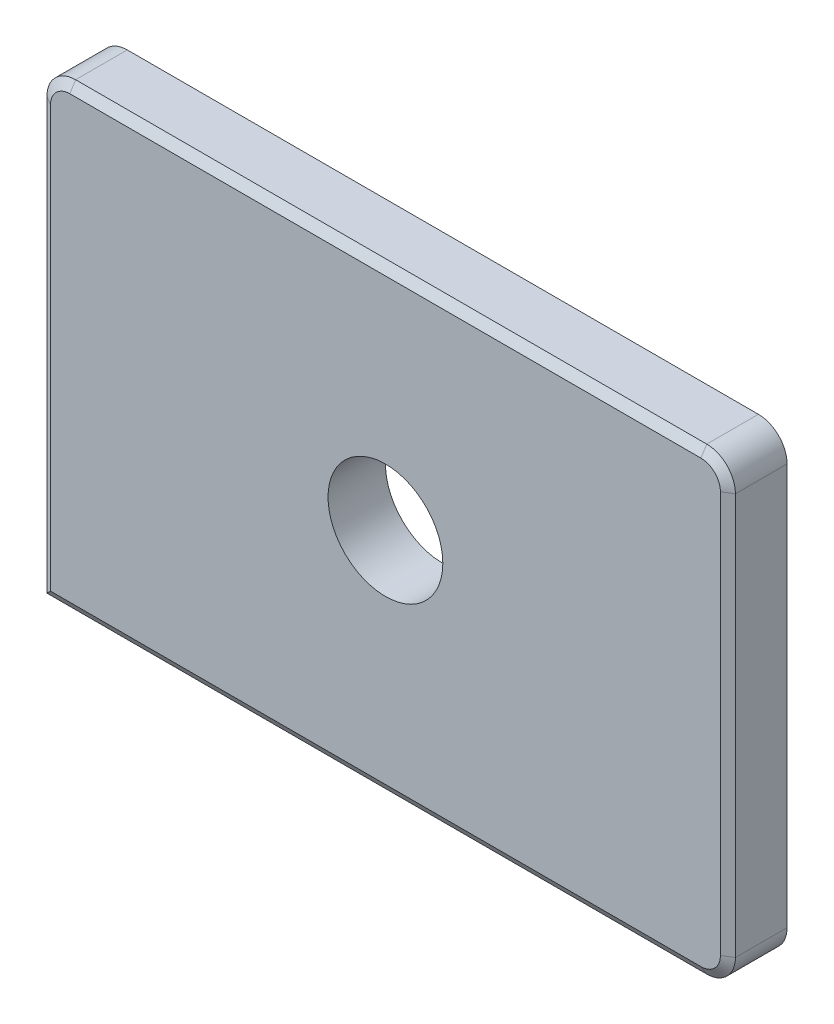
ISO-10303-21;
HEADER;
FILE_DESCRIPTION(('STEP AP214'),'2;1');
FILE_NAME('part.step','',(''),(''),'','','');
FILE_SCHEMA(('AUTOMOTIVE_DESIGN { 1 0 10303 214 1 1 1 1 }'));
ENDSEC;
DATA;
#1=APPLICATION_CONTEXT('core data for automotive mechanical design processes');
#2=APPLICATION_PROTOCOL_DEFINITION('international standard','automotive_design',2000,#1);
#3=PRODUCT_CONTEXT('',#1,'mechanical');
#4=PRODUCT('Part','Part','',(#3));
#5=PRODUCT_RELATED_PRODUCT_CATEGORY('part','',(#4));
#6=PRODUCT_DEFINITION_FORMATION('','',#4);
#7=PRODUCT_DEFINITION_CONTEXT('part definition',#1,'design');
#8=PRODUCT_DEFINITION('design','',#6,#7);
#9=PRODUCT_DEFINITION_SHAPE('','',#8);
#10=(LENGTH_UNIT() NAMED_UNIT(*) SI_UNIT(.MILLI.,.METRE.));
#11=(NAMED_UNIT(*) PLANE_ANGLE_UNIT() SI_UNIT($,.RADIAN.));
#12=(NAMED_UNIT(*) SI_UNIT($,.STERADIAN.) SOLID_ANGLE_UNIT());
#13=UNCERTAINTY_MEASURE_WITH_UNIT(LENGTH_MEASURE(1.E-05),#10,'distance_accuracy_value','');
#14=(GEOMETRIC_REPRESENTATION_CONTEXT(3) GLOBAL_UNCERTAINTY_ASSIGNED_CONTEXT((#13)) GLOBAL_UNIT_ASSIGNED_CONTEXT((#10,
#11,#12)) REPRESENTATION_CONTEXT('',''));
#15=CARTESIAN_POINT('',(0.,0.,0.));
#16=DIRECTION('',(0.,0.,1.));
#17=DIRECTION('',(1.,0.,0.));
#18=AXIS2_PLACEMENT_3D('',#15,#16,#17);
#19=CARTESIAN_POINT('',(-60.,40.,10.));
#20=DIRECTION('',(1.,0.,0.));
#21=DIRECTION('',(0.,0.,-1.));
#22=AXIS2_PLACEMENT_3D('',#19,#20,#21);
#23=PLANE('',#22);
#24=DIRECTION('',(0.,0.,-1.));
#25=VECTOR('',#24,1.);
#26=CARTESIAN_POINT('',(-60.,-40.,10.));
#27=LINE('',#26,#25);
#28=CARTESIAN_POINT('',(-60.,-40.,9.));
#29=VERTEX_POINT('',#28);
#30=CARTESIAN_POINT('',(-60.,-40.,0.));
#31=VERTEX_POINT('',#30);
#32=EDGE_CURVE('E122',#29,#31,#27,.T.);
#33=ORIENTED_EDGE('',*,*,#32,.F.);
#34=DIRECTION('',(0.,1.,0.));
#35=VECTOR('',#34,1.);
#36=CARTESIAN_POINT('',(-60.,35.,9.));
#37=LINE('',#36,#35);
#38=CARTESIAN_POINT('',(-60.,35.,9.));
#39=VERTEX_POINT('',#38);
#40=EDGE_CURVE('E189',#29,#39,#37,.T.);
#41=ORIENTED_EDGE('',*,*,#40,.T.);
#42=DIRECTION('',(0.,0.,-1.));
#43=VECTOR('',#42,1.);
#44=CARTESIAN_POINT('',(-60.,35.,10.));
#45=LINE('',#44,#43);
#46=CARTESIAN_POINT('',(-60.,35.,0.));
#47=VERTEX_POINT('',#46);
#48=EDGE_CURVE('E136',#39,#47,#45,.T.);
#49=ORIENTED_EDGE('',*,*,#48,.T.);
#50=DIRECTION('',(0.,-1.,0.));
#51=VECTOR('',#50,1.);
#52=CARTESIAN_POINT('',(-60.,40.,0.));
#53=LINE('',#52,#51);
#54=EDGE_CURVE('E135',#47,#31,#53,.T.);
#55=ORIENTED_EDGE('',*,*,#54,.T.);
#56=EDGE_LOOP('',(#33,#41,#49,#55));
#57=FACE_BOUND('',#56,.T.);
#58=ADVANCED_FACE('F37',(#57),#23,.F.);
#59=CARTESIAN_POINT('',(-60.,-40.,10.));
#60=DIRECTION('',(0.,1.,0.));
#61=DIRECTION('',(0.,0.,1.));
#62=AXIS2_PLACEMENT_3D('',#59,#60,#61);
#63=PLANE('',#62);
#64=DIRECTION('',(0.,0.,-1.));
#65=VECTOR('',#64,1.);
#66=CARTESIAN_POINT('',(55.,-40.,10.));
#67=LINE('',#66,#65);
#68=CARTESIAN_POINT('',(55.,-40.,0.));
#69=VERTEX_POINT('',#68);
#70=CARTESIAN_POINT('',(55.,-40.,9.));
#71=VERTEX_POINT('',#70);
#72=EDGE_CURVE('E162',#69,#71,#67,.F.);
#73=ORIENTED_EDGE('',*,*,#72,.T.);
#74=DIRECTION('',(-1.,0.,0.));
#75=VECTOR('',#74,1.);
#76=CARTESIAN_POINT('',(-60.,-40.,9.));
#77=LINE('',#76,#75);
#78=EDGE_CURVE('E128',#71,#29,#77,.T.);
#79=ORIENTED_EDGE('',*,*,#78,.T.);
#80=ORIENTED_EDGE('',*,*,#32,.T.);
#81=DIRECTION('',(1.,0.,0.));
#82=VECTOR('',#81,1.);
#83=CARTESIAN_POINT('',(-60.,-40.,0.));
#84=LINE('',#83,#82);
#85=EDGE_CURVE('E126',#31,#69,#84,.T.);
#86=ORIENTED_EDGE('',*,*,#85,.T.);
#87=EDGE_LOOP('',(#73,#79,#80,#86));
#88=FACE_BOUND('',#87,.T.);
#89=ADVANCED_FACE('F124',(#88),#63,.F.);
#90=CARTESIAN_POINT('',(60.,40.,10.));
#91=DIRECTION('',(-1.,0.,0.));
#92=DIRECTION('',(0.,0.,1.));
#93=AXIS2_PLACEMENT_3D('',#90,#91,#92);
#94=PLANE('',#93);
#95=DIRECTION('',(0.,0.,-1.));
#96=VECTOR('',#95,1.);
#97=CARTESIAN_POINT('',(60.,35.,10.));
#98=LINE('',#97,#96);
#99=CARTESIAN_POINT('',(60.,35.,0.));
#100=VERTEX_POINT('',#99);
#101=CARTESIAN_POINT('',(60.,35.,9.));
#102=VERTEX_POINT('',#101);
#103=EDGE_CURVE('E131',#100,#102,#98,.F.);
#104=ORIENTED_EDGE('',*,*,#103,.T.);
#105=DIRECTION('',(0.,-1.,0.));
#106=VECTOR('',#105,1.);
#107=CARTESIAN_POINT('',(60.,-35.,9.));
#108=LINE('',#107,#106);
#109=CARTESIAN_POINT('',(60.,-35.,9.));
#110=VERTEX_POINT('',#109);
#111=EDGE_CURVE('E186',#102,#110,#108,.T.);
#112=ORIENTED_EDGE('',*,*,#111,.T.);
#113=DIRECTION('',(0.,0.,-1.));
#114=VECTOR('',#113,1.);
#115=CARTESIAN_POINT('',(60.,-35.,10.));
#116=LINE('',#115,#114);
#117=CARTESIAN_POINT('',(60.,-35.,0.));
#118=VERTEX_POINT('',#117);
#119=EDGE_CURVE('E155',#110,#118,#116,.T.);
#120=ORIENTED_EDGE('',*,*,#119,.T.);
#121=DIRECTION('',(0.,1.,0.));
#122=VECTOR('',#121,1.);
#123=CARTESIAN_POINT('',(60.,40.,0.));
#124=LINE('',#123,#122);
#125=EDGE_CURVE('E145',#118,#100,#124,.T.);
#126=ORIENTED_EDGE('',*,*,#125,.T.);
#127=EDGE_LOOP('',(#104,#112,#120,#126));
#128=FACE_BOUND('',#127,.T.);
#129=ADVANCED_FACE('F242',(#128),#94,.F.);
#130=CARTESIAN_POINT('',(-60.,40.,10.));
#131=DIRECTION('',(0.,-1.,0.));
#132=DIRECTION('',(0.,0.,-1.));
#133=AXIS2_PLACEMENT_3D('',#130,#131,#132);
#134=PLANE('',#133);
#135=DIRECTION('',(0.,0.,-1.));
#136=VECTOR('',#135,1.);
#137=CARTESIAN_POINT('',(-55.,40.,10.));
#138=LINE('',#137,#136);
#139=CARTESIAN_POINT('',(-55.,40.,0.));
#140=VERTEX_POINT('',#139);
#141=CARTESIAN_POINT('',(-55.,40.,9.));
#142=VERTEX_POINT('',#141);
#143=EDGE_CURVE('E167',#140,#142,#138,.F.);
#144=ORIENTED_EDGE('',*,*,#143,.T.);
#145=DIRECTION('',(1.,0.,0.));
#146=VECTOR('',#145,1.);
#147=CARTESIAN_POINT('',(55.,40.,9.));
#148=LINE('',#147,#146);
#149=CARTESIAN_POINT('',(55.,40.,9.));
#150=VERTEX_POINT('',#149);
#151=EDGE_CURVE('E11',#142,#150,#148,.T.);
#152=ORIENTED_EDGE('',*,*,#151,.T.);
#153=DIRECTION('',(0.,0.,-1.));
#154=VECTOR('',#153,1.);
#155=CARTESIAN_POINT('',(55.,40.,10.));
#156=LINE('',#155,#154);
#157=CARTESIAN_POINT('',(55.,40.,0.));
#158=VERTEX_POINT('',#157);
#159=EDGE_CURVE('E165',#150,#158,#156,.T.);
#160=ORIENTED_EDGE('',*,*,#159,.T.);
#161=DIRECTION('',(-1.,0.,0.));
#162=VECTOR('',#161,1.);
#163=CARTESIAN_POINT('',(-60.,40.,0.));
#164=LINE('',#163,#162);
#165=EDGE_CURVE('E132',#158,#140,#164,.T.);
#166=ORIENTED_EDGE('',*,*,#165,.T.);
#167=EDGE_LOOP('',(#144,#152,#160,#166));
#168=FACE_BOUND('',#167,.T.);
#169=ADVANCED_FACE('F309',(#168),#134,.F.);
#170=CARTESIAN_POINT('',(0.,0.,10.));
#171=DIRECTION('',(0.,0.,1.));
#172=DIRECTION('',(1.,0.,0.));
#173=AXIS2_PLACEMENT_3D('',#170,#171,#172);
#174=PLANE('',#173);
#175=DIRECTION('',(0.,-1.,0.));
#176=VECTOR('',#175,1.);
#177=CARTESIAN_POINT('',(-58.3802248094562,-40.,10.));
#178=LINE('',#177,#176);
#179=CARTESIAN_POINT('',(-58.3802248094562,35.,10.));
#180=VERTEX_POINT('',#179);
#181=CARTESIAN_POINT('',(-58.3802248094562,-38.3802248094562,10.));
#182=VERTEX_POINT('',#181);
#183=EDGE_CURVE('E173',#180,#182,#178,.T.);
#184=ORIENTED_EDGE('',*,*,#183,.T.);
#185=DIRECTION('',(1.,0.,0.));
#186=VECTOR('',#185,1.);
#187=CARTESIAN_POINT('',(55.,-38.3802248094562,10.));
#188=LINE('',#187,#186);
#189=CARTESIAN_POINT('',(55.,-38.3802248094562,10.));
#190=VERTEX_POINT('',#189);
#191=EDGE_CURVE('E182',#182,#190,#188,.T.);
#192=ORIENTED_EDGE('',*,*,#191,.T.);
#193=CARTESIAN_POINT('',(55.,-35.,10.));
#194=DIRECTION('',(0.,0.,1.));
#195=DIRECTION('',(1.,0.,0.));
#196=AXIS2_PLACEMENT_3D('',#193,#194,#195);
#197=CIRCLE('',#196,3.38022480945618);
#198=CARTESIAN_POINT('',(58.3802248094562,-35.,10.));
#199=VERTEX_POINT('',#198);
#200=EDGE_CURVE('E180',#190,#199,#197,.T.);
#201=ORIENTED_EDGE('',*,*,#200,.T.);
#202=DIRECTION('',(0.,1.,0.));
#203=VECTOR('',#202,1.);
#204=CARTESIAN_POINT('',(58.3802248094562,35.,10.));
#205=LINE('',#204,#203);
#206=CARTESIAN_POINT('',(58.3802248094562,35.,10.));
#207=VERTEX_POINT('',#206);
#208=EDGE_CURVE('E177',#199,#207,#205,.T.);
#209=ORIENTED_EDGE('',*,*,#208,.T.);
#210=CARTESIAN_POINT('',(55.,35.,10.));
#211=DIRECTION('',(0.,0.,1.));
#212=DIRECTION('',(1.,0.,0.));
#213=AXIS2_PLACEMENT_3D('',#210,#211,#212);
#214=CIRCLE('',#213,3.38022480945618);
#215=CARTESIAN_POINT('',(55.,38.3802248094562,10.));
#216=VERTEX_POINT('',#215);
#217=EDGE_CURVE('E175',#207,#216,#214,.T.);
#218=ORIENTED_EDGE('',*,*,#217,.T.);
#219=DIRECTION('',(-1.,0.,0.));
#220=VECTOR('',#219,1.);
#221=CARTESIAN_POINT('',(-55.,38.3802248094562,10.));
#222=LINE('',#221,#220);
#223=CARTESIAN_POINT('',(-55.,38.3802248094562,10.));
#224=VERTEX_POINT('',#223);
#225=EDGE_CURVE('E171',#216,#224,#222,.T.);
#226=ORIENTED_EDGE('',*,*,#225,.T.);
#227=CARTESIAN_POINT('',(-55.,35.,10.));
#228=DIRECTION('',(0.,0.,1.));
#229=DIRECTION('',(1.,0.,0.));
#230=AXIS2_PLACEMENT_3D('',#227,#228,#229);
#231=CIRCLE('',#230,3.38022480945618);
#232=EDGE_CURVE('E169',#224,#180,#231,.T.);
#233=ORIENTED_EDGE('',*,*,#232,.T.);
#234=EDGE_LOOP('',(#184,#192,#201,#209,#218,#226,#233));
#235=FACE_BOUND('',#234,.T.);
#236=CARTESIAN_POINT('',(0.,0.,10.));
#237=DIRECTION('',(0.,0.,1.));
#238=DIRECTION('',(1.,0.,0.));
#239=AXIS2_PLACEMENT_3D('',#236,#237,#238);
#240=CIRCLE('',#239,10.);
#241=CARTESIAN_POINT('',(10.,0.,10.));
#242=VERTEX_POINT('',#241);
#243=EDGE_CURVE('E212',#242,#242,#240,.T.);
#244=ORIENTED_EDGE('',*,*,#243,.F.);
#245=EDGE_LOOP('',(#244));
#246=FACE_BOUND('',#245,.T.);
#247=ADVANCED_FACE('F234',(#235,#246),#174,.T.);
#248=CARTESIAN_POINT('',(0.,0.,0.));
#249=DIRECTION('',(0.,0.,1.));
#250=DIRECTION('',(1.,0.,0.));
#251=AXIS2_PLACEMENT_3D('',#248,#249,#250);
#252=PLANE('',#251);
#253=CARTESIAN_POINT('',(0.,0.,0.));
#254=DIRECTION('',(0.,0.,1.));
#255=DIRECTION('',(1.,0.,0.));
#256=AXIS2_PLACEMENT_3D('',#253,#254,#255);
#257=CIRCLE('',#256,10.);
#258=CARTESIAN_POINT('',(10.,0.,0.));
#259=VERTEX_POINT('',#258);
#260=EDGE_CURVE('E139',#259,#259,#257,.T.);
#261=ORIENTED_EDGE('',*,*,#260,.T.);
#262=EDGE_LOOP('',(#261));
#263=FACE_BOUND('',#262,.T.);
#264=ORIENTED_EDGE('',*,*,#125,.F.);
#265=CARTESIAN_POINT('',(55.,-35.,0.));
#266=DIRECTION('',(0.,0.,1.));
#267=DIRECTION('',(1.,0.,0.));
#268=AXIS2_PLACEMENT_3D('',#265,#266,#267);
#269=CIRCLE('',#268,5.);
#270=EDGE_CURVE('E144',#118,#69,#269,.F.);
#271=ORIENTED_EDGE('',*,*,#270,.T.);
#272=ORIENTED_EDGE('',*,*,#85,.F.);
#273=ORIENTED_EDGE('',*,*,#54,.F.);
#274=CARTESIAN_POINT('',(-55.,35.,0.));
#275=DIRECTION('',(0.,0.,1.));
#276=DIRECTION('',(1.,0.,0.));
#277=AXIS2_PLACEMENT_3D('',#274,#275,#276);
#278=CIRCLE('',#277,5.);
#279=EDGE_CURVE('E159',#47,#140,#278,.F.);
#280=ORIENTED_EDGE('',*,*,#279,.T.);
#281=ORIENTED_EDGE('',*,*,#165,.F.);
#282=CARTESIAN_POINT('',(55.,35.,0.));
#283=DIRECTION('',(0.,0.,1.));
#284=DIRECTION('',(1.,0.,0.));
#285=AXIS2_PLACEMENT_3D('',#282,#283,#284);
#286=CIRCLE('',#285,5.);
#287=EDGE_CURVE('E157',#158,#100,#286,.F.);
#288=ORIENTED_EDGE('',*,*,#287,.T.);
#289=EDGE_LOOP('',(#264,#271,#272,#273,#280,#281,#288));
#290=FACE_BOUND('',#289,.T.);
#291=ADVANCED_FACE('F142',(#263,#290),#252,.F.);
#292=CARTESIAN_POINT('',(0.,0.,0.));
#293=DIRECTION('',(0.,0.,1.));
#294=DIRECTION('',(1.,0.,0.));
#295=AXIS2_PLACEMENT_3D('',#292,#293,#294);
#296=CYLINDRICAL_SURFACE('',#295,10.);
#297=ORIENTED_EDGE('',*,*,#260,.F.);
#298=EDGE_LOOP('',(#297));
#299=FACE_BOUND('',#298,.T.);
#300=ORIENTED_EDGE('',*,*,#243,.T.);
#301=EDGE_LOOP('',(#300));
#302=FACE_BOUND('',#301,.T.);
#303=ADVANCED_FACE('F224',(#299,#302),#296,.F.);
#304=CARTESIAN_POINT('',(55.,-35.,10.));
#305=DIRECTION('',(0.,0.,-1.));
#306=DIRECTION('',(-1.,0.,0.));
#307=AXIS2_PLACEMENT_3D('',#304,#305,#306);
#308=CYLINDRICAL_SURFACE('',#307,5.);
#309=ORIENTED_EDGE('',*,*,#119,.F.);
#310=CARTESIAN_POINT('',(55.,-35.,9.));
#311=DIRECTION('',(0.,0.,1.));
#312=DIRECTION('',(1.,0.,0.));
#313=AXIS2_PLACEMENT_3D('',#310,#311,#312);
#314=CIRCLE('',#313,5.);
#315=EDGE_CURVE('E62',#110,#71,#314,.F.);
#316=ORIENTED_EDGE('',*,*,#315,.T.);
#317=ORIENTED_EDGE('',*,*,#72,.F.);
#318=ORIENTED_EDGE('',*,*,#270,.F.);
#319=EDGE_LOOP('',(#309,#316,#317,#318));
#320=FACE_BOUND('',#319,.T.);
#321=ADVANCED_FACE('F226',(#320),#308,.T.);
#322=CARTESIAN_POINT('',(-55.,35.,10.));
#323=DIRECTION('',(0.,0.,-1.));
#324=DIRECTION('',(-1.,0.,0.));
#325=AXIS2_PLACEMENT_3D('',#322,#323,#324);
#326=CYLINDRICAL_SURFACE('',#325,5.);
#327=ORIENTED_EDGE('',*,*,#48,.F.);
#328=CARTESIAN_POINT('',(-55.,35.,9.));
#329=DIRECTION('',(0.,0.,1.));
#330=DIRECTION('',(1.,0.,0.));
#331=AXIS2_PLACEMENT_3D('',#328,#329,#330);
#332=CIRCLE('',#331,5.);
#333=EDGE_CURVE('E47',#39,#142,#332,.F.);
#334=ORIENTED_EDGE('',*,*,#333,.T.);
#335=ORIENTED_EDGE('',*,*,#143,.F.);
#336=ORIENTED_EDGE('',*,*,#279,.F.);
#337=EDGE_LOOP('',(#327,#334,#335,#336));
#338=FACE_BOUND('',#337,.T.);
#339=ADVANCED_FACE('F232',(#338),#326,.T.);
#340=CARTESIAN_POINT('',(55.,35.,10.));
#341=DIRECTION('',(0.,0.,-1.));
#342=DIRECTION('',(-1.,0.,0.));
#343=AXIS2_PLACEMENT_3D('',#340,#341,#342);
#344=CYLINDRICAL_SURFACE('',#343,5.);
#345=ORIENTED_EDGE('',*,*,#159,.F.);
#346=CARTESIAN_POINT('',(55.,35.,9.));
#347=DIRECTION('',(0.,0.,1.));
#348=DIRECTION('',(1.,0.,0.));
#349=AXIS2_PLACEMENT_3D('',#346,#347,#348);
#350=CIRCLE('',#349,5.);
#351=EDGE_CURVE('E184',#150,#102,#350,.F.);
#352=ORIENTED_EDGE('',*,*,#351,.T.);
#353=ORIENTED_EDGE('',*,*,#103,.F.);
#354=ORIENTED_EDGE('',*,*,#287,.F.);
#355=EDGE_LOOP('',(#345,#352,#353,#354));
#356=FACE_BOUND('',#355,.T.);
#357=ADVANCED_FACE('F248',(#356),#344,.T.);
#358=CARTESIAN_POINT('',(-58.3802248094562,0.,10.));
#359=DIRECTION('',(-0.52532198881774,0.,0.850903524534112));
#360=DIRECTION('',(0.,1.,0.));
#361=AXIS2_PLACEMENT_3D('',#358,#359,#360);
#362=PLANE('',#361);
#363=DIRECTION('',(-0.648047822492768,-0.648047822492768,-0.400085040366123));
#364=VECTOR('',#363,1.);
#365=CARTESIAN_POINT('',(-33.8625164708604,-13.8625164708604,25.1364883730342));
#366=LINE('',#365,#364);
#367=EDGE_CURVE('E206',#182,#29,#366,.T.);
#368=ORIENTED_EDGE('',*,*,#367,.F.);
#369=ORIENTED_EDGE('',*,*,#183,.F.);
#370=DIRECTION('',(0.850903524534112,0.,0.52532198881774));
#371=VECTOR('',#370,1.);
#372=CARTESIAN_POINT('',(-60.,35.,9.));
#373=LINE('',#372,#371);
#374=EDGE_CURVE('E42',#39,#180,#373,.T.);
#375=ORIENTED_EDGE('',*,*,#374,.F.);
#376=ORIENTED_EDGE('',*,*,#40,.F.);
#377=EDGE_LOOP('',(#368,#369,#375,#376));
#378=FACE_BOUND('',#377,.T.);
#379=ADVANCED_FACE('F40',(#378),#362,.T.);
#380=CARTESIAN_POINT('',(-55.,35.,10.));
#381=DIRECTION('',(0.,0.,-1.));
#382=DIRECTION('',(-1.,0.,0.));
#383=AXIS2_PLACEMENT_3D('',#380,#381,#382);
#384=CONICAL_SURFACE('',#383,3.38022480945618,1.01770284974288);
#385=ORIENTED_EDGE('',*,*,#374,.T.);
#386=ORIENTED_EDGE('',*,*,#232,.F.);
#387=DIRECTION('',(0.,-0.850903524534112,0.52532198881774));
#388=VECTOR('',#387,1.);
#389=CARTESIAN_POINT('',(-55.,40.,9.));
#390=LINE('',#389,#388);
#391=EDGE_CURVE('E204',#142,#224,#390,.T.);
#392=ORIENTED_EDGE('',*,*,#391,.F.);
#393=ORIENTED_EDGE('',*,*,#333,.F.);
#394=EDGE_LOOP('',(#385,#386,#392,#393));
#395=FACE_BOUND('',#394,.T.);
#396=ADVANCED_FACE('F286',(#395),#384,.T.);
#397=CARTESIAN_POINT('',(0.,-38.3802248094562,10.));
#398=DIRECTION('',(0.,-0.52532198881774,0.850903524534112));
#399=DIRECTION('',(-1.,0.,0.));
#400=AXIS2_PLACEMENT_3D('',#397,#398,#399);
#401=PLANE('',#400);
#402=ORIENTED_EDGE('',*,*,#367,.T.);
#403=ORIENTED_EDGE('',*,*,#78,.F.);
#404=DIRECTION('',(0.,-0.850903524534112,-0.52532198881774));
#405=VECTOR('',#404,1.);
#406=CARTESIAN_POINT('',(55.,-38.3802248094562,10.));
#407=LINE('',#406,#405);
#408=EDGE_CURVE('E201',#190,#71,#407,.T.);
#409=ORIENTED_EDGE('',*,*,#408,.F.);
#410=ORIENTED_EDGE('',*,*,#191,.F.);
#411=EDGE_LOOP('',(#402,#403,#409,#410));
#412=FACE_BOUND('',#411,.T.);
#413=ADVANCED_FACE('F280',(#412),#401,.T.);
#414=CARTESIAN_POINT('',(0.,38.3802248094562,10.));
#415=DIRECTION('',(0.,0.52532198881774,0.850903524534112));
#416=DIRECTION('',(1.,0.,0.));
#417=AXIS2_PLACEMENT_3D('',#414,#415,#416);
#418=PLANE('',#417);
#419=ORIENTED_EDGE('',*,*,#391,.T.);
#420=ORIENTED_EDGE('',*,*,#225,.F.);
#421=DIRECTION('',(0.,-0.850903524534112,0.52532198881774));
#422=VECTOR('',#421,1.);
#423=CARTESIAN_POINT('',(55.,40.,9.));
#424=LINE('',#423,#422);
#425=EDGE_CURVE('E198',#150,#216,#424,.T.);
#426=ORIENTED_EDGE('',*,*,#425,.F.);
#427=ORIENTED_EDGE('',*,*,#151,.F.);
#428=EDGE_LOOP('',(#419,#420,#426,#427));
#429=FACE_BOUND('',#428,.T.);
#430=ADVANCED_FACE('F273',(#429),#418,.T.);
#431=CARTESIAN_POINT('',(55.,-35.,10.));
#432=DIRECTION('',(0.,0.,-1.));
#433=DIRECTION('',(-1.,0.,0.));
#434=AXIS2_PLACEMENT_3D('',#431,#432,#433);
#435=CONICAL_SURFACE('',#434,3.38022480945618,1.01770284974288);
#436=ORIENTED_EDGE('',*,*,#408,.T.);
#437=ORIENTED_EDGE('',*,*,#315,.F.);
#438=DIRECTION('',(0.850903524534112,0.,-0.52532198881774));
#439=VECTOR('',#438,1.);
#440=CARTESIAN_POINT('',(58.3802248094562,-35.,10.));
#441=LINE('',#440,#439);
#442=EDGE_CURVE('E196',#199,#110,#441,.T.);
#443=ORIENTED_EDGE('',*,*,#442,.F.);
#444=ORIENTED_EDGE('',*,*,#200,.F.);
#445=EDGE_LOOP('',(#436,#437,#443,#444));
#446=FACE_BOUND('',#445,.T.);
#447=ADVANCED_FACE('F266',(#446),#435,.T.);
#448=CARTESIAN_POINT('',(55.,35.,10.));
#449=DIRECTION('',(0.,0.,-1.));
#450=DIRECTION('',(-1.,0.,0.));
#451=AXIS2_PLACEMENT_3D('',#448,#449,#450);
#452=CONICAL_SURFACE('',#451,3.38022480945618,1.01770284974288);
#453=ORIENTED_EDGE('',*,*,#425,.T.);
#454=ORIENTED_EDGE('',*,*,#217,.F.);
#455=DIRECTION('',(-0.850903524534112,0.,0.52532198881774));
#456=VECTOR('',#455,1.);
#457=CARTESIAN_POINT('',(60.,35.,9.));
#458=LINE('',#457,#456);
#459=EDGE_CURVE('E194',#102,#207,#458,.T.);
#460=ORIENTED_EDGE('',*,*,#459,.F.);
#461=ORIENTED_EDGE('',*,*,#351,.F.);
#462=EDGE_LOOP('',(#453,#454,#460,#461));
#463=FACE_BOUND('',#462,.T.);
#464=ADVANCED_FACE('F259',(#463),#452,.T.);
#465=CARTESIAN_POINT('',(58.3802248094562,0.,10.));
#466=DIRECTION('',(0.52532198881774,0.,0.850903524534112));
#467=DIRECTION('',(0.,-1.,0.));
#468=AXIS2_PLACEMENT_3D('',#465,#466,#467);
#469=PLANE('',#468);
#470=ORIENTED_EDGE('',*,*,#442,.T.);
#471=ORIENTED_EDGE('',*,*,#111,.F.);
#472=ORIENTED_EDGE('',*,*,#459,.T.);
#473=ORIENTED_EDGE('',*,*,#208,.F.);
#474=EDGE_LOOP('',(#470,#471,#472,#473));
#475=FACE_BOUND('',#474,.T.);
#476=ADVANCED_FACE('F253',(#475),#469,.T.);
#477=CLOSED_SHELL('',(#58,#89,#129,#169,#247,#291,#303,#321,#339,#357,#379,#396,#413,#430,#447,
#464,#476));
#478=MANIFOLD_SOLID_BREP('B2',#477);
#479=ADVANCED_BREP_SHAPE_REPRESENTATION('',(#18,#478),#14);
#480=SHAPE_DEFINITION_REPRESENTATION(#9,#479);
ENDSEC;
END-ISO-10303-21;
